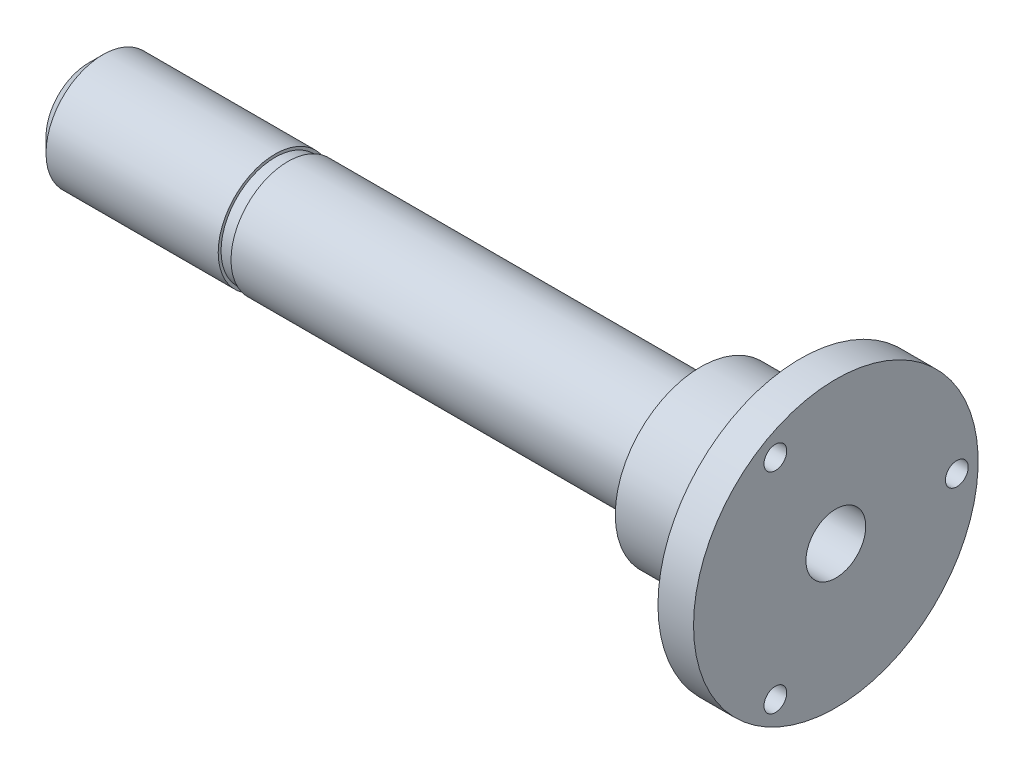
ISO-10303-21;
HEADER;
FILE_DESCRIPTION(('STEP AP214'),'2;1');
FILE_NAME('part.step','',(''),(''),'','','');
FILE_SCHEMA(('AUTOMOTIVE_DESIGN { 1 0 10303 214 1 1 1 1 }'));
ENDSEC;
DATA;
#1=APPLICATION_CONTEXT('core data for automotive mechanical design processes');
#2=APPLICATION_PROTOCOL_DEFINITION('international standard','automotive_design',2000,#1);
#3=PRODUCT_CONTEXT('',#1,'mechanical');
#4=PRODUCT('Part','Part','',(#3));
#5=PRODUCT_RELATED_PRODUCT_CATEGORY('part','',(#4));
#6=PRODUCT_DEFINITION_FORMATION('','',#4);
#7=PRODUCT_DEFINITION_CONTEXT('part definition',#1,'design');
#8=PRODUCT_DEFINITION('design','',#6,#7);
#9=PRODUCT_DEFINITION_SHAPE('','',#8);
#10=(LENGTH_UNIT() NAMED_UNIT(*) SI_UNIT(.MILLI.,.METRE.));
#11=(NAMED_UNIT(*) PLANE_ANGLE_UNIT() SI_UNIT($,.RADIAN.));
#12=(NAMED_UNIT(*) SI_UNIT($,.STERADIAN.) SOLID_ANGLE_UNIT());
#13=UNCERTAINTY_MEASURE_WITH_UNIT(LENGTH_MEASURE(1.E-05),#10,'distance_accuracy_value','');
#14=(GEOMETRIC_REPRESENTATION_CONTEXT(3) GLOBAL_UNCERTAINTY_ASSIGNED_CONTEXT((#13)) GLOBAL_UNIT_ASSIGNED_CONTEXT((#10,
#11,#12)) REPRESENTATION_CONTEXT('',''));
#15=CARTESIAN_POINT('',(0.,0.,0.));
#16=DIRECTION('',(0.,0.,1.));
#17=DIRECTION('',(1.,0.,0.));
#18=AXIS2_PLACEMENT_3D('',#15,#16,#17);
#19=CARTESIAN_POINT('',(-49.9999999999545,2.73826333105213E-11,-2.86084968126802E-11));
#20=DIRECTION('',(1.,0.,5.72169936254125E-13));
#21=DIRECTION('',(5.72169936254125E-13,0.,-1.));
#22=AXIS2_PLACEMENT_3D('',#19,#20,#21);
#23=CONICAL_SURFACE('',#22,2.99999999999626,0.785398163397446);
#24=CARTESIAN_POINT('',(-48.9999999999782,2.73826333105213E-11,-2.80363268764396E-11));
#25=DIRECTION('',(-1.,0.,-5.72169936254125E-13));
#26=DIRECTION('',(-5.72169936254125E-13,0.,1.));
#27=AXIS2_PLACEMENT_3D('',#24,#25,#26);
#28=CIRCLE('',#27,3.99999999997262);
#29=CARTESIAN_POINT('',(-48.9999999999805,2.73826333105213E-11,3.99999999994458));
#30=VERTEX_POINT('',#29);
#31=EDGE_CURVE('E78',#30,#30,#28,.T.);
#32=ORIENTED_EDGE('',*,*,#31,.T.);
#33=EDGE_LOOP('',(#32));
#34=FACE_BOUND('',#33,.T.);
#35=CARTESIAN_POINT('',(-49.9999999999545,2.73826333105213E-11,-2.86084968126802E-11));
#36=DIRECTION('',(-1.,0.,-5.72169936254125E-13));
#37=DIRECTION('',(-5.72169936254125E-13,0.,1.));
#38=AXIS2_PLACEMENT_3D('',#35,#36,#37);
#39=CIRCLE('',#38,2.99999999999626);
#40=CARTESIAN_POINT('',(-49.9999999999562,2.73826333105213E-11,2.99999999996766));
#41=VERTEX_POINT('',#40);
#42=EDGE_CURVE('E10',#41,#41,#39,.T.);
#43=ORIENTED_EDGE('',*,*,#42,.F.);
#44=EDGE_LOOP('',(#43));
#45=FACE_BOUND('',#44,.T.);
#46=ADVANCED_FACE('F32',(#34,#45),#23,.T.);
#47=CARTESIAN_POINT('',(-49.9999999999545,2.1,-2.86084968126802E-11));
#48=DIRECTION('',(-1.,0.,-5.72169936254125E-13));
#49=DIRECTION('',(-5.72169936254125E-13,0.,1.));
#50=AXIS2_PLACEMENT_3D('',#47,#48,#49);
#51=PLANE('',#50);
#52=ORIENTED_EDGE('',*,*,#42,.T.);
#53=EDGE_LOOP('',(#52));
#54=FACE_BOUND('',#53,.T.);
#55=CARTESIAN_POINT('',(-49.9999999999545,2.73826333105213E-11,-2.86084968126802E-11));
#56=DIRECTION('',(-1.,0.,-5.72169936254125E-13));
#57=DIRECTION('',(-5.72169936254125E-13,0.,1.));
#58=AXIS2_PLACEMENT_3D('',#55,#56,#57);
#59=CIRCLE('',#58,2.09999999997262);
#60=CARTESIAN_POINT('',(-49.9999999999557,2.73826333105213E-11,2.09999999994401));
#61=VERTEX_POINT('',#60);
#62=EDGE_CURVE('E38',#61,#61,#59,.T.);
#63=ORIENTED_EDGE('',*,*,#62,.F.);
#64=EDGE_LOOP('',(#63));
#65=FACE_BOUND('',#64,.T.);
#66=ADVANCED_FACE('F180',(#54,#65),#51,.T.);
#67=CARTESIAN_POINT('',(-4.25521625320939E-11,2.73826333105213E-11,0.));
#68=DIRECTION('',(-1.,0.,-5.72169936254125E-13));
#69=DIRECTION('',(-5.72169936254125E-13,0.,1.));
#70=AXIS2_PLACEMENT_3D('',#67,#68,#69);
#71=CYLINDRICAL_SURFACE('',#70,2.09999999997263);
#72=ORIENTED_EDGE('',*,*,#62,.T.);
#73=EDGE_LOOP('',(#72));
#74=FACE_BOUND('',#73,.T.);
#75=CARTESIAN_POINT('',(2.5,2.73826333105213E-11,1.43042484063531E-12));
#76=DIRECTION('',(-1.,0.,-5.72169936254125E-13));
#77=DIRECTION('',(-5.72169936254125E-13,0.,1.));
#78=AXIS2_PLACEMENT_3D('',#75,#76,#77);
#79=CIRCLE('',#78,2.09999999997265);
#80=CARTESIAN_POINT('',(2.4999999999988,2.73826333105213E-11,2.09999999997408));
#81=VERTEX_POINT('',#80);
#82=EDGE_CURVE('E42',#81,#81,#79,.T.);
#83=ORIENTED_EDGE('',*,*,#82,.F.);
#84=EDGE_LOOP('',(#83));
#85=FACE_BOUND('',#84,.T.);
#86=ADVANCED_FACE('F107',(#74,#85),#71,.F.);
#87=CARTESIAN_POINT('',(2.5,10.0000000000274,1.43042484063531E-12));
#88=DIRECTION('',(1.,0.,5.72169936254125E-13));
#89=DIRECTION('',(5.72169936254125E-13,0.,-1.));
#90=AXIS2_PLACEMENT_3D('',#87,#88,#89);
#91=PLANE('',#90);
#92=CARTESIAN_POINT('',(2.50000000000486,0.,-8.49999999999857));
#93=DIRECTION('',(1.,0.,5.72169936254125E-13));
#94=DIRECTION('',(5.72169936254125E-13,0.,-1.));
#95=AXIS2_PLACEMENT_3D('',#92,#93,#94);
#96=CIRCLE('',#95,0.799999999999999);
#97=CARTESIAN_POINT('',(2.50000000000532,0.,-9.29999999999857));
#98=VERTEX_POINT('',#97);
#99=EDGE_CURVE('E96',#98,#98,#96,.T.);
#100=ORIENTED_EDGE('',*,*,#99,.F.);
#101=EDGE_LOOP('',(#100));
#102=FACE_BOUND('',#101,.T.);
#103=CARTESIAN_POINT('',(2.49999999999757,7.36121593216771,4.25000000000147));
#104=DIRECTION('',(1.,0.,5.72169936254125E-13));
#105=DIRECTION('',(5.72169936254125E-13,0.,-1.));
#106=AXIS2_PLACEMENT_3D('',#103,#104,#105);
#107=CIRCLE('',#106,0.799999999999999);
#108=CARTESIAN_POINT('',(2.49999999999802,7.36121593216771,3.45000000000147));
#109=VERTEX_POINT('',#108);
#110=EDGE_CURVE('E90',#109,#109,#107,.T.);
#111=ORIENTED_EDGE('',*,*,#110,.F.);
#112=EDGE_LOOP('',(#111));
#113=FACE_BOUND('',#112,.T.);
#114=CARTESIAN_POINT('',(2.49999999999757,-7.36121593216771,4.25000000000146));
#115=DIRECTION('',(1.,0.,5.72169936254125E-13));
#116=DIRECTION('',(5.72169936254125E-13,0.,-1.));
#117=AXIS2_PLACEMENT_3D('',#114,#115,#116);
#118=CIRCLE('',#117,0.799999999999999);
#119=CARTESIAN_POINT('',(2.49999999999802,-7.36121593216771,3.45000000000146));
#120=VERTEX_POINT('',#119);
#121=EDGE_CURVE('E84',#120,#120,#118,.T.);
#122=ORIENTED_EDGE('',*,*,#121,.F.);
#123=EDGE_LOOP('',(#122));
#124=FACE_BOUND('',#123,.T.);
#125=ORIENTED_EDGE('',*,*,#82,.T.);
#126=EDGE_LOOP('',(#125));
#127=FACE_BOUND('',#126,.T.);
#128=CARTESIAN_POINT('',(2.5,2.73826333105213E-11,1.43042484063531E-12));
#129=DIRECTION('',(-1.,0.,-5.72169936254125E-13));
#130=DIRECTION('',(-5.72169936254125E-13,0.,1.));
#131=AXIS2_PLACEMENT_3D('',#128,#129,#130);
#132=CIRCLE('',#131,10.);
#133=CARTESIAN_POINT('',(2.49999999999428,2.73826333105213E-11,10.0000000000015));
#134=VERTEX_POINT('',#133);
#135=EDGE_CURVE('E46',#134,#134,#132,.T.);
#136=ORIENTED_EDGE('',*,*,#135,.F.);
#137=EDGE_LOOP('',(#136));
#138=FACE_BOUND('',#137,.T.);
#139=ADVANCED_FACE('F103',(#102,#113,#124,#127,#138),#91,.T.);
#140=CARTESIAN_POINT('',(-4.25521625320939E-11,2.73826333105213E-11,0.));
#141=DIRECTION('',(-1.,0.,-5.72169936254125E-13));
#142=DIRECTION('',(-5.72169936254125E-13,0.,1.));
#143=AXIS2_PLACEMENT_3D('',#140,#141,#142);
#144=CYLINDRICAL_SURFACE('',#143,10.);
#145=ORIENTED_EDGE('',*,*,#135,.T.);
#146=EDGE_LOOP('',(#145));
#147=FACE_BOUND('',#146,.T.);
#148=CARTESIAN_POINT('',(0.,2.73826333105213E-11,0.));
#149=DIRECTION('',(-1.,0.,-5.72169936254125E-13));
#150=DIRECTION('',(-5.72169936254125E-13,0.,1.));
#151=AXIS2_PLACEMENT_3D('',#148,#149,#150);
#152=CIRCLE('',#151,10.);
#153=CARTESIAN_POINT('',(-5.72256672427925E-12,2.73826333105213E-11,10.));
#154=VERTEX_POINT('',#153);
#155=EDGE_CURVE('E51',#154,#154,#152,.T.);
#156=ORIENTED_EDGE('',*,*,#155,.F.);
#157=EDGE_LOOP('',(#156));
#158=FACE_BOUND('',#157,.T.);
#159=ADVANCED_FACE('F106',(#147,#158),#144,.T.);
#160=CARTESIAN_POINT('',(0.,6.00000000000003,0.));
#161=DIRECTION('',(-1.,0.,-5.72169936254125E-13));
#162=DIRECTION('',(-5.72169936254125E-13,0.,1.));
#163=AXIS2_PLACEMENT_3D('',#160,#161,#162);
#164=PLANE('',#163);
#165=CARTESIAN_POINT('',(4.86242990316299E-12,0.,-8.5));
#166=DIRECTION('',(-1.,0.,-5.72169936254125E-13));
#167=DIRECTION('',(-5.72169936254125E-13,0.,1.));
#168=AXIS2_PLACEMENT_3D('',#165,#166,#167);
#169=CIRCLE('',#168,0.799999999999999);
#170=CARTESIAN_POINT('',(4.40469395415969E-12,0.,-7.7));
#171=VERTEX_POINT('',#170);
#172=EDGE_CURVE('E93',#171,#171,#169,.T.);
#173=ORIENTED_EDGE('',*,*,#172,.F.);
#174=EDGE_LOOP('',(#173));
#175=FACE_BOUND('',#174,.T.);
#176=CARTESIAN_POINT('',(-2.43251599418848E-12,7.36121593216771,4.25000000000004));
#177=DIRECTION('',(-1.,0.,-5.72169936254125E-13));
#178=DIRECTION('',(-5.72169936254125E-13,0.,1.));
#179=AXIS2_PLACEMENT_3D('',#176,#177,#178);
#180=CIRCLE('',#179,0.799999999999999);
#181=CARTESIAN_POINT('',(-2.89025194319178E-12,7.36121593216771,5.05000000000004));
#182=VERTEX_POINT('',#181);
#183=EDGE_CURVE('E87',#182,#182,#180,.T.);
#184=ORIENTED_EDGE('',*,*,#183,.F.);
#185=EDGE_LOOP('',(#184));
#186=FACE_BOUND('',#185,.T.);
#187=CARTESIAN_POINT('',(-2.43251599418848E-12,-7.36121593216771,4.25000000000003));
#188=DIRECTION('',(-1.,0.,-5.72169936254125E-13));
#189=DIRECTION('',(-5.72169936254125E-13,0.,1.));
#190=AXIS2_PLACEMENT_3D('',#187,#188,#189);
#191=CIRCLE('',#190,0.799999999999999);
#192=CARTESIAN_POINT('',(-2.89025194319178E-12,-7.36121593216771,5.05000000000003));
#193=VERTEX_POINT('',#192);
#194=EDGE_CURVE('E81',#193,#193,#191,.T.);
#195=ORIENTED_EDGE('',*,*,#194,.F.);
#196=EDGE_LOOP('',(#195));
#197=FACE_BOUND('',#196,.T.);
#198=ORIENTED_EDGE('',*,*,#155,.T.);
#199=EDGE_LOOP('',(#198));
#200=FACE_BOUND('',#199,.T.);
#201=CARTESIAN_POINT('',(0.,2.73826333105213E-11,0.));
#202=DIRECTION('',(-1.,0.,-5.72169936254125E-13));
#203=DIRECTION('',(-5.72169936254125E-13,0.,1.));
#204=AXIS2_PLACEMENT_3D('',#201,#202,#203);
#205=CIRCLE('',#204,5.99999999997265);
#206=CARTESIAN_POINT('',(-3.43388697924709E-12,2.73826333105213E-11,5.99999999997265));
#207=VERTEX_POINT('',#206);
#208=EDGE_CURVE('E54',#207,#207,#205,.T.);
#209=ORIENTED_EDGE('',*,*,#208,.F.);
#210=EDGE_LOOP('',(#209));
#211=FACE_BOUND('',#210,.T.);
#212=ADVANCED_FACE('F119',(#175,#186,#197,#200,#211),#164,.T.);
#213=CARTESIAN_POINT('',(-4.25521625320939E-11,2.73826333105213E-11,0.));
#214=DIRECTION('',(-1.,0.,-5.72169936254125E-13));
#215=DIRECTION('',(-5.72169936254125E-13,0.,1.));
#216=AXIS2_PLACEMENT_3D('',#213,#214,#215);
#217=CYLINDRICAL_SURFACE('',#216,5.99999999997264);
#218=ORIENTED_EDGE('',*,*,#208,.T.);
#219=EDGE_LOOP('',(#218));
#220=FACE_BOUND('',#219,.T.);
#221=CARTESIAN_POINT('',(-7.,2.73826333105213E-11,-4.00518955377887E-12));
#222=DIRECTION('',(-1.,0.,-5.72169936254125E-13));
#223=DIRECTION('',(-5.72169936254125E-13,0.,1.));
#224=AXIS2_PLACEMENT_3D('',#221,#222,#223);
#225=CIRCLE('',#224,5.99999999997262);
#226=CARTESIAN_POINT('',(-7.00000000000343,2.73826333105213E-11,5.99999999996861));
#227=VERTEX_POINT('',#226);
#228=EDGE_CURVE('E57',#227,#227,#225,.T.);
#229=ORIENTED_EDGE('',*,*,#228,.F.);
#230=EDGE_LOOP('',(#229));
#231=FACE_BOUND('',#230,.T.);
#232=ADVANCED_FACE('F125',(#220,#231),#217,.T.);
#233=CARTESIAN_POINT('',(-7.,4.2,-4.00518955377887E-12));
#234=DIRECTION('',(-1.,0.,-5.72169936254125E-13));
#235=DIRECTION('',(-5.72169936254125E-13,0.,1.));
#236=AXIS2_PLACEMENT_3D('',#233,#234,#235);
#237=PLANE('',#236);
#238=ORIENTED_EDGE('',*,*,#228,.T.);
#239=EDGE_LOOP('',(#238));
#240=FACE_BOUND('',#239,.T.);
#241=CARTESIAN_POINT('',(-7.,2.73826333105213E-11,-4.00518955377887E-12));
#242=DIRECTION('',(-1.,0.,-5.72169936254125E-13));
#243=DIRECTION('',(-5.72169936254125E-13,0.,1.));
#244=AXIS2_PLACEMENT_3D('',#241,#242,#243);
#245=CIRCLE('',#244,4.19999999997262);
#246=CARTESIAN_POINT('',(-7.0000000000024,2.73826333105213E-11,4.19999999996861));
#247=VERTEX_POINT('',#246);
#248=EDGE_CURVE('E60',#247,#247,#245,.T.);
#249=ORIENTED_EDGE('',*,*,#248,.F.);
#250=EDGE_LOOP('',(#249));
#251=FACE_BOUND('',#250,.T.);
#252=ADVANCED_FACE('F132',(#240,#251),#237,.T.);
#253=CARTESIAN_POINT('',(-7.2,2.73826100682939E-11,-4.1196235410297E-12));
#254=DIRECTION('',(-1.,0.,-5.72169936254125E-13));
#255=DIRECTION('',(-5.72169936254125E-13,0.,1.));
#256=AXIS2_PLACEMENT_3D('',#253,#254,#255);
#257=TOROIDAL_SURFACE('',#256,4.19999999997266,0.2);
#258=ORIENTED_EDGE('',*,*,#248,.T.);
#259=EDGE_LOOP('',(#258));
#260=FACE_BOUND('',#259,.T.);
#261=CARTESIAN_POINT('',(-7.2,2.73826333105213E-11,-4.1196235410297E-12));
#262=DIRECTION('',(-1.,0.,-5.72169936254125E-13));
#263=DIRECTION('',(-5.72169936254125E-13,0.,1.));
#264=AXIS2_PLACEMENT_3D('',#261,#262,#263);
#265=CIRCLE('',#264,3.99999999997266);
#266=CARTESIAN_POINT('',(-7.20000000000229,2.73826333105213E-11,3.99999999996854));
#267=VERTEX_POINT('',#266);
#268=EDGE_CURVE('E63',#267,#267,#265,.T.);
#269=ORIENTED_EDGE('',*,*,#268,.F.);
#270=EDGE_LOOP('',(#269));
#271=FACE_BOUND('',#270,.T.);
#272=ADVANCED_FACE('F138',(#260,#271),#257,.F.);
#273=CARTESIAN_POINT('',(-4.25521625320939E-11,2.73826333105213E-11,0.));
#274=DIRECTION('',(-1.,0.,-5.72169936254125E-13));
#275=DIRECTION('',(-5.72169936254125E-13,0.,1.));
#276=AXIS2_PLACEMENT_3D('',#273,#274,#275);
#277=CYLINDRICAL_SURFACE('',#276,3.99999999997264);
#278=ORIENTED_EDGE('',*,*,#268,.T.);
#279=EDGE_LOOP('',(#278));
#280=FACE_BOUND('',#279,.T.);
#281=CARTESIAN_POINT('',(-36.,2.73826333105213E-11,-2.05981177051485E-11));
#282=DIRECTION('',(-1.,0.,-5.72169936254125E-13));
#283=DIRECTION('',(-5.72169936254125E-13,0.,1.));
#284=AXIS2_PLACEMENT_3D('',#281,#282,#283);
#285=CIRCLE('',#284,3.99999999997262);
#286=CARTESIAN_POINT('',(-36.0000000000023,2.73826333105213E-11,3.99999999995202));
#287=VERTEX_POINT('',#286);
#288=EDGE_CURVE('E66',#287,#287,#285,.T.);
#289=ORIENTED_EDGE('',*,*,#288,.F.);
#290=EDGE_LOOP('',(#289));
#291=FACE_BOUND('',#290,.T.);
#292=ADVANCED_FACE('F144',(#280,#291),#277,.T.);
#293=CARTESIAN_POINT('',(-36.,3.8,-2.05981177051485E-11));
#294=DIRECTION('',(-1.,0.,-5.72169936254125E-13));
#295=DIRECTION('',(-5.72169936254125E-13,0.,1.));
#296=AXIS2_PLACEMENT_3D('',#293,#294,#295);
#297=PLANE('',#296);
#298=ORIENTED_EDGE('',*,*,#288,.T.);
#299=EDGE_LOOP('',(#298));
#300=FACE_BOUND('',#299,.T.);
#301=CARTESIAN_POINT('',(-36.,2.73826333105213E-11,-2.05981177051485E-11));
#302=DIRECTION('',(-1.,0.,-5.72169936254125E-13));
#303=DIRECTION('',(-5.72169936254125E-13,0.,1.));
#304=AXIS2_PLACEMENT_3D('',#301,#302,#303);
#305=CIRCLE('',#304,3.79999999997262);
#306=CARTESIAN_POINT('',(-36.0000000000022,2.73826333105213E-11,3.79999999995202));
#307=VERTEX_POINT('',#306);
#308=EDGE_CURVE('E69',#307,#307,#305,.T.);
#309=ORIENTED_EDGE('',*,*,#308,.F.);
#310=EDGE_LOOP('',(#309));
#311=FACE_BOUND('',#310,.T.);
#312=ADVANCED_FACE('F150',(#300,#311),#297,.T.);
#313=CARTESIAN_POINT('',(-4.25521625320939E-11,2.73826333105213E-11,0.));
#314=DIRECTION('',(-1.,0.,-5.72169936254125E-13));
#315=DIRECTION('',(-5.72169936254125E-13,0.,1.));
#316=AXIS2_PLACEMENT_3D('',#313,#314,#315);
#317=CYLINDRICAL_SURFACE('',#316,3.79999999997262);
#318=ORIENTED_EDGE('',*,*,#308,.T.);
#319=EDGE_LOOP('',(#318));
#320=FACE_BOUND('',#319,.T.);
#321=CARTESIAN_POINT('',(-36.9,2.73826333105213E-11,-2.11130706477772E-11));
#322=DIRECTION('',(-1.,0.,-5.72169936254125E-13));
#323=DIRECTION('',(-5.72169936254125E-13,0.,1.));
#324=AXIS2_PLACEMENT_3D('',#321,#322,#323);
#325=CIRCLE('',#324,3.79999999997262);
#326=CARTESIAN_POINT('',(-36.9000000000022,2.73826333105213E-11,3.7999999999515));
#327=VERTEX_POINT('',#326);
#328=EDGE_CURVE('E72',#327,#327,#325,.T.);
#329=ORIENTED_EDGE('',*,*,#328,.F.);
#330=EDGE_LOOP('',(#329));
#331=FACE_BOUND('',#330,.T.);
#332=ADVANCED_FACE('F156',(#320,#331),#317,.T.);
#333=CARTESIAN_POINT('',(-36.9,4.,-2.11130706477772E-11));
#334=DIRECTION('',(1.,0.,5.72169936254125E-13));
#335=DIRECTION('',(5.72169936254125E-13,0.,-1.));
#336=AXIS2_PLACEMENT_3D('',#333,#334,#335);
#337=PLANE('',#336);
#338=ORIENTED_EDGE('',*,*,#328,.T.);
#339=EDGE_LOOP('',(#338));
#340=FACE_BOUND('',#339,.T.);
#341=CARTESIAN_POINT('',(-36.9,2.73826333105213E-11,-2.11130706477772E-11));
#342=DIRECTION('',(-1.,0.,-5.72169936254125E-13));
#343=DIRECTION('',(-5.72169936254125E-13,0.,1.));
#344=AXIS2_PLACEMENT_3D('',#341,#342,#343);
#345=CIRCLE('',#344,3.99999999997262);
#346=CARTESIAN_POINT('',(-36.9000000000023,2.73826333105213E-11,3.9999999999515));
#347=VERTEX_POINT('',#346);
#348=EDGE_CURVE('E75',#347,#347,#345,.T.);
#349=ORIENTED_EDGE('',*,*,#348,.F.);
#350=EDGE_LOOP('',(#349));
#351=FACE_BOUND('',#350,.T.);
#352=ADVANCED_FACE('F162',(#340,#351),#337,.T.);
#353=CARTESIAN_POINT('',(-4.25521625320939E-11,2.73826333105213E-11,0.));
#354=DIRECTION('',(-1.,0.,-5.72169936254125E-13));
#355=DIRECTION('',(-5.72169936254125E-13,0.,1.));
#356=AXIS2_PLACEMENT_3D('',#353,#354,#355);
#357=CYLINDRICAL_SURFACE('',#356,3.99999999997262);
#358=ORIENTED_EDGE('',*,*,#348,.T.);
#359=EDGE_LOOP('',(#358));
#360=FACE_BOUND('',#359,.T.);
#361=ORIENTED_EDGE('',*,*,#31,.F.);
#362=EDGE_LOOP('',(#361));
#363=FACE_BOUND('',#362,.T.);
#364=ADVANCED_FACE('F168',(#360,#363),#357,.T.);
#365=CARTESIAN_POINT('',(2.49999999999757,-7.36121593216771,4.25000000000146));
#366=DIRECTION('',(1.,0.,5.72169936254125E-13));
#367=DIRECTION('',(5.72169936254125E-13,0.,-1.));
#368=AXIS2_PLACEMENT_3D('',#365,#366,#367);
#369=CYLINDRICAL_SURFACE('',#368,0.799999999999999);
#370=ORIENTED_EDGE('',*,*,#121,.T.);
#371=EDGE_LOOP('',(#370));
#372=FACE_BOUND('',#371,.T.);
#373=ORIENTED_EDGE('',*,*,#194,.T.);
#374=EDGE_LOOP('',(#373));
#375=FACE_BOUND('',#374,.T.);
#376=ADVANCED_FACE('F174',(#372,#375),#369,.F.);
#377=CARTESIAN_POINT('',(2.49999999999757,7.36121593216771,4.25000000000147));
#378=DIRECTION('',(1.,0.,5.72169936254125E-13));
#379=DIRECTION('',(5.72169936254125E-13,0.,-1.));
#380=AXIS2_PLACEMENT_3D('',#377,#378,#379);
#381=CYLINDRICAL_SURFACE('',#380,0.799999999999999);
#382=ORIENTED_EDGE('',*,*,#110,.T.);
#383=EDGE_LOOP('',(#382));
#384=FACE_BOUND('',#383,.T.);
#385=ORIENTED_EDGE('',*,*,#183,.T.);
#386=EDGE_LOOP('',(#385));
#387=FACE_BOUND('',#386,.T.);
#388=ADVANCED_FACE('F192',(#384,#387),#381,.F.);
#389=CARTESIAN_POINT('',(2.50000000000486,0.,-8.49999999999857));
#390=DIRECTION('',(1.,0.,5.72169936254125E-13));
#391=DIRECTION('',(5.72169936254125E-13,0.,-1.));
#392=AXIS2_PLACEMENT_3D('',#389,#390,#391);
#393=CYLINDRICAL_SURFACE('',#392,0.799999999999999);
#394=ORIENTED_EDGE('',*,*,#99,.T.);
#395=EDGE_LOOP('',(#394));
#396=FACE_BOUND('',#395,.T.);
#397=ORIENTED_EDGE('',*,*,#172,.T.);
#398=EDGE_LOOP('',(#397));
#399=FACE_BOUND('',#398,.T.);
#400=ADVANCED_FACE('F100',(#396,#399),#393,.F.);
#401=CLOSED_SHELL('',(#46,#66,#86,#139,#159,#212,#232,#252,#272,#292,#312,#332,#352,#364,#376,
#388,#400));
#402=MANIFOLD_SOLID_BREP('B2',#401);
#403=ADVANCED_BREP_SHAPE_REPRESENTATION('',(#18,#402),#14);
#404=SHAPE_DEFINITION_REPRESENTATION(#9,#403);
ENDSEC;
END-ISO-10303-21;
